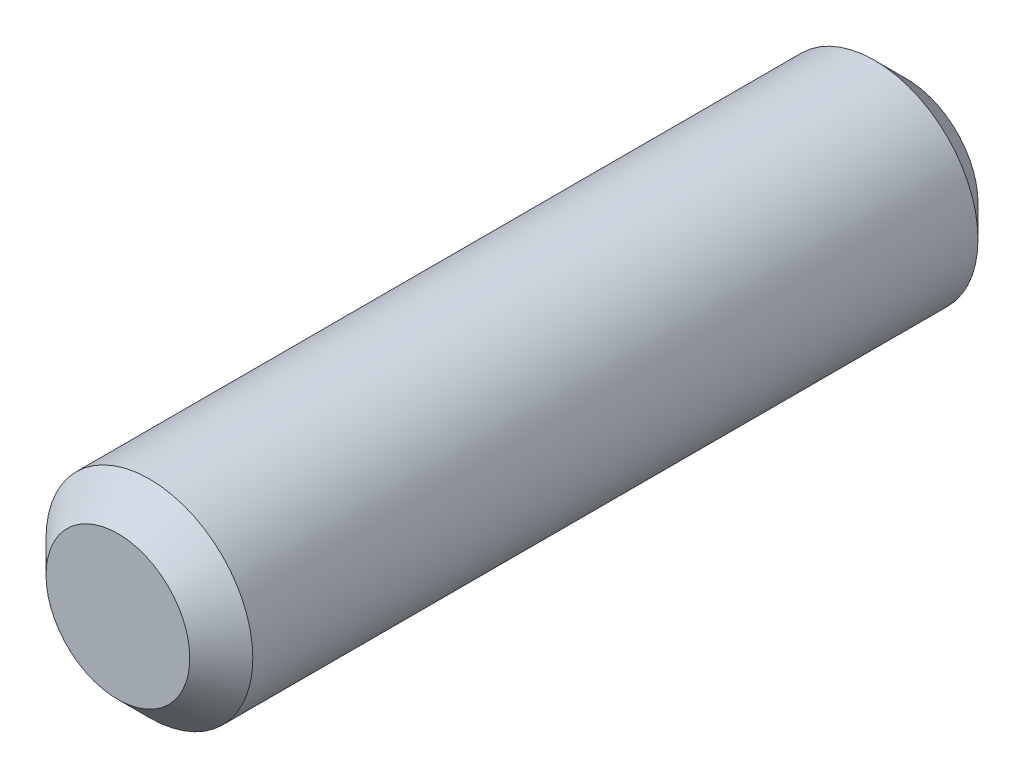
ISO-10303-21;
HEADER;
FILE_DESCRIPTION(('STEP AP214'),'2;1');
FILE_NAME('part.step','',(''),(''),'','','');
FILE_SCHEMA(('AUTOMOTIVE_DESIGN { 1 0 10303 214 1 1 1 1 }'));
ENDSEC;
DATA;
#1=APPLICATION_CONTEXT('core data for automotive mechanical design processes');
#2=APPLICATION_PROTOCOL_DEFINITION('international standard','automotive_design',2000,#1);
#3=PRODUCT_CONTEXT('',#1,'mechanical');
#4=PRODUCT('Part','Part','',(#3));
#5=PRODUCT_RELATED_PRODUCT_CATEGORY('part','',(#4));
#6=PRODUCT_DEFINITION_FORMATION('','',#4);
#7=PRODUCT_DEFINITION_CONTEXT('part definition',#1,'design');
#8=PRODUCT_DEFINITION('design','',#6,#7);
#9=PRODUCT_DEFINITION_SHAPE('','',#8);
#10=(LENGTH_UNIT() NAMED_UNIT(*) SI_UNIT(.MILLI.,.METRE.));
#11=(NAMED_UNIT(*) PLANE_ANGLE_UNIT() SI_UNIT($,.RADIAN.));
#12=(NAMED_UNIT(*) SI_UNIT($,.STERADIAN.) SOLID_ANGLE_UNIT());
#13=UNCERTAINTY_MEASURE_WITH_UNIT(LENGTH_MEASURE(1.E-05),#10,'distance_accuracy_value','');
#14=(GEOMETRIC_REPRESENTATION_CONTEXT(3) GLOBAL_UNCERTAINTY_ASSIGNED_CONTEXT((#13)) GLOBAL_UNIT_ASSIGNED_CONTEXT((#10,
#11,#12)) REPRESENTATION_CONTEXT('',''));
#15=CARTESIAN_POINT('',(0.,0.,0.));
#16=DIRECTION('',(0.,0.,1.));
#17=DIRECTION('',(1.,0.,0.));
#18=AXIS2_PLACEMENT_3D('',#15,#16,#17);
#19=CARTESIAN_POINT('',(12.7,0.,-16.6666666666667));
#20=DIRECTION('',(0.,0.,1.));
#21=DIRECTION('',(1.,0.,0.));
#22=AXIS2_PLACEMENT_3D('',#19,#20,#21);
#23=PLANE('',#22);
#24=CARTESIAN_POINT('',(12.7,0.,-16.6666666665757));
#25=DIRECTION('',(0.,0.,1.));
#26=DIRECTION('',(1.,0.,0.));
#27=AXIS2_PLACEMENT_3D('',#24,#25,#26);
#28=CIRCLE('',#27,3.04000000013596);
#29=CARTESIAN_POINT('',(15.740000000136,0.,-16.6666666665757));
#30=VERTEX_POINT('',#29);
#31=EDGE_CURVE('E40',#30,#30,#28,.T.);
#32=ORIENTED_EDGE('',*,*,#31,.F.);
#33=EDGE_LOOP('',(#32));
#34=FACE_BOUND('',#33,.T.);
#35=ADVANCED_FACE('F37',(#34),#23,.F.);
#36=CARTESIAN_POINT('',(12.7,0.,16.6666666666667));
#37=DIRECTION('',(0.,0.,1.));
#38=DIRECTION('',(1.,0.,0.));
#39=AXIS2_PLACEMENT_3D('',#36,#37,#38);
#40=PLANE('',#39);
#41=CARTESIAN_POINT('',(12.7,0.,16.6666666665757));
#42=DIRECTION('',(0.,0.,-1.));
#43=DIRECTION('',(-1.,0.,0.));
#44=AXIS2_PLACEMENT_3D('',#41,#42,#43);
#45=CIRCLE('',#44,3.04000000013596);
#46=CARTESIAN_POINT('',(9.65999999986404,0.,16.6666666665757));
#47=VERTEX_POINT('',#46);
#48=EDGE_CURVE('E49',#47,#47,#45,.T.);
#49=ORIENTED_EDGE('',*,*,#48,.F.);
#50=EDGE_LOOP('',(#49));
#51=FACE_BOUND('',#50,.T.);
#52=ADVANCED_FACE('F60',(#51),#40,.T.);
#53=CARTESIAN_POINT('',(12.7,0.,-15.3333333337287));
#54=DIRECTION('',(0.,0.,1.));
#55=DIRECTION('',(1.,0.,0.));
#56=AXIS2_PLACEMENT_3D('',#53,#54,#55);
#57=CONICAL_SURFACE('',#56,4.37333333298302,0.785398163397448);
#58=CARTESIAN_POINT('',(12.7,0.,-15.3333333333333));
#59=DIRECTION('',(0.,0.,1.));
#60=DIRECTION('',(1.,0.,0.));
#61=AXIS2_PLACEMENT_3D('',#58,#59,#60);
#62=CIRCLE('',#61,4.37333333333333);
#63=CARTESIAN_POINT('',(17.0733333333333,0.,-15.3333333333333));
#64=VERTEX_POINT('',#63);
#65=EDGE_CURVE('E44',#64,#64,#62,.T.);
#66=ORIENTED_EDGE('',*,*,#65,.F.);
#67=EDGE_LOOP('',(#66));
#68=FACE_BOUND('',#67,.T.);
#69=ORIENTED_EDGE('',*,*,#31,.T.);
#70=EDGE_LOOP('',(#69));
#71=FACE_BOUND('',#70,.T.);
#72=ADVANCED_FACE('F57',(#68,#71),#57,.T.);
#73=CARTESIAN_POINT('',(12.7,0.,15.3333333337287));
#74=DIRECTION('',(0.,0.,-1.));
#75=DIRECTION('',(-1.,0.,0.));
#76=AXIS2_PLACEMENT_3D('',#73,#74,#75);
#77=CONICAL_SURFACE('',#76,4.37333333298302,0.785398163397448);
#78=CARTESIAN_POINT('',(12.7,0.,15.3333333333333));
#79=DIRECTION('',(0.,0.,1.));
#80=DIRECTION('',(1.,0.,0.));
#81=AXIS2_PLACEMENT_3D('',#78,#79,#80);
#82=CIRCLE('',#81,4.37333333333333);
#83=CARTESIAN_POINT('',(17.0733333333333,0.,15.3333333333333));
#84=VERTEX_POINT('',#83);
#85=EDGE_CURVE('E10',#84,#84,#82,.F.);
#86=ORIENTED_EDGE('',*,*,#85,.F.);
#87=EDGE_LOOP('',(#86));
#88=FACE_BOUND('',#87,.T.);
#89=ORIENTED_EDGE('',*,*,#48,.T.);
#90=EDGE_LOOP('',(#89));
#91=FACE_BOUND('',#90,.T.);
#92=ADVANCED_FACE('F67',(#88,#91),#77,.T.);
#93=CARTESIAN_POINT('',(12.7,0.,-16.6666666666667));
#94=DIRECTION('',(0.,0.,1.));
#95=DIRECTION('',(1.,0.,0.));
#96=AXIS2_PLACEMENT_3D('',#93,#94,#95);
#97=CYLINDRICAL_SURFACE('',#96,4.37333333333333);
#98=ORIENTED_EDGE('',*,*,#85,.T.);
#99=EDGE_LOOP('',(#98));
#100=FACE_BOUND('',#99,.T.);
#101=ORIENTED_EDGE('',*,*,#65,.T.);
#102=EDGE_LOOP('',(#101));
#103=FACE_BOUND('',#102,.T.);
#104=ADVANCED_FACE('F65',(#100,#103),#97,.T.);
#105=CLOSED_SHELL('',(#35,#52,#72,#92,#104));
#106=MANIFOLD_SOLID_BREP('B2',#105);
#107=ADVANCED_BREP_SHAPE_REPRESENTATION('',(#18,#106),#14);
#108=SHAPE_DEFINITION_REPRESENTATION(#9,#107);
ENDSEC;
END-ISO-10303-21;
